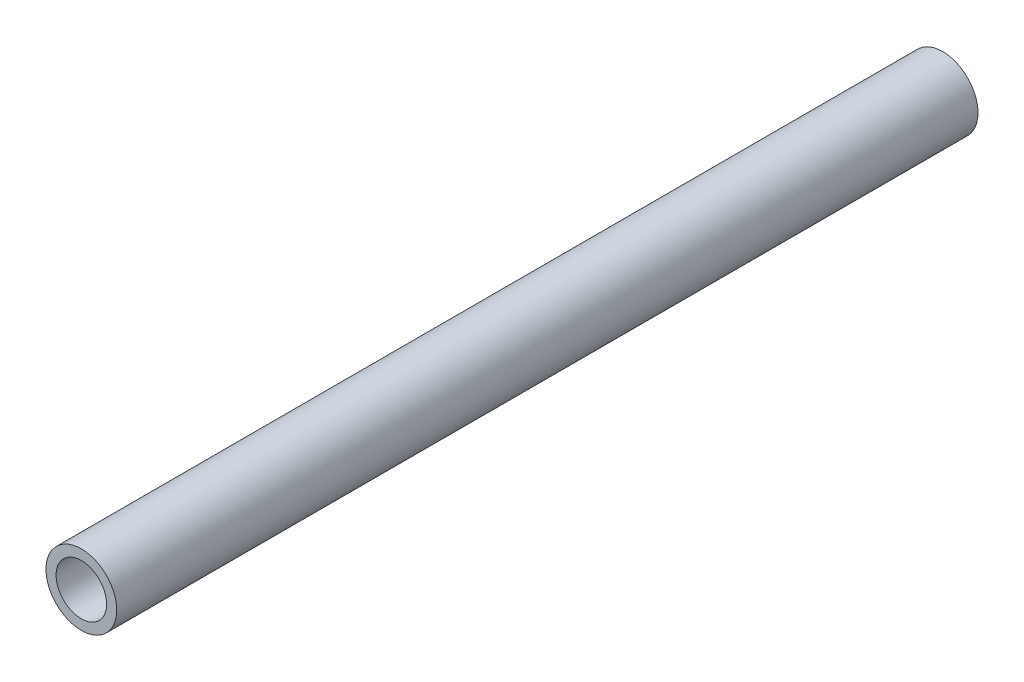
ISO-10303-21;
HEADER;
FILE_DESCRIPTION(('STEP AP214'),'2;1');
FILE_NAME('part.step','',(''),(''),'','','');
FILE_SCHEMA(('AUTOMOTIVE_DESIGN { 1 0 10303 214 1 1 1 1 }'));
ENDSEC;
DATA;
#1=APPLICATION_CONTEXT('core data for automotive mechanical design processes');
#2=APPLICATION_PROTOCOL_DEFINITION('international standard','automotive_design',2000,#1);
#3=PRODUCT_CONTEXT('',#1,'mechanical');
#4=PRODUCT('Part','Part','',(#3));
#5=PRODUCT_RELATED_PRODUCT_CATEGORY('part','',(#4));
#6=PRODUCT_DEFINITION_FORMATION('','',#4);
#7=PRODUCT_DEFINITION_CONTEXT('part definition',#1,'design');
#8=PRODUCT_DEFINITION('design','',#6,#7);
#9=PRODUCT_DEFINITION_SHAPE('','',#8);
#10=(LENGTH_UNIT() NAMED_UNIT(*) SI_UNIT(.MILLI.,.METRE.));
#11=(NAMED_UNIT(*) PLANE_ANGLE_UNIT() SI_UNIT($,.RADIAN.));
#12=(NAMED_UNIT(*) SI_UNIT($,.STERADIAN.) SOLID_ANGLE_UNIT());
#13=UNCERTAINTY_MEASURE_WITH_UNIT(LENGTH_MEASURE(1.E-05),#10,'distance_accuracy_value','');
#14=(GEOMETRIC_REPRESENTATION_CONTEXT(3) GLOBAL_UNCERTAINTY_ASSIGNED_CONTEXT((#13)) GLOBAL_UNIT_ASSIGNED_CONTEXT((#10,
#11,#12)) REPRESENTATION_CONTEXT('',''));
#15=CARTESIAN_POINT('',(0.,0.,0.));
#16=DIRECTION('',(0.,0.,1.));
#17=DIRECTION('',(1.,0.,0.));
#18=AXIS2_PLACEMENT_3D('',#15,#16,#17);
#19=CARTESIAN_POINT('',(0.,0.,-30.0521739130434));
#20=DIRECTION('',(0.,0.,-1.));
#21=DIRECTION('',(0.,1.,0.));
#22=AXIS2_PLACEMENT_3D('',#19,#20,#21);
#23=CYLINDRICAL_SURFACE('',#22,50.);
#24=CARTESIAN_POINT('',(0.,0.,0.));
#25=DIRECTION('',(0.,0.,-1.));
#26=DIRECTION('',(0.,1.,0.));
#27=AXIS2_PLACEMENT_3D('',#24,#25,#26);
#28=CIRCLE('',#27,50.);
#29=CARTESIAN_POINT('',(0.,50.,0.));
#30=VERTEX_POINT('',#29);
#31=EDGE_CURVE('E10',#30,#30,#28,.T.);
#32=ORIENTED_EDGE('',*,*,#31,.T.);
#33=EDGE_LOOP('',(#32));
#34=FACE_BOUND('',#33,.T.);
#35=CARTESIAN_POINT('',(0.,-2.01650560807022E-13,1705.));
#36=DIRECTION('',(0.,0.,-1.));
#37=DIRECTION('',(0.,1.,0.));
#38=AXIS2_PLACEMENT_3D('',#35,#36,#37);
#39=CIRCLE('',#38,50.0000000000001);
#40=CARTESIAN_POINT('',(0.,49.9999999999999,1705.));
#41=VERTEX_POINT('',#40);
#42=EDGE_CURVE('E50',#41,#41,#39,.T.);
#43=ORIENTED_EDGE('',*,*,#42,.F.);
#44=EDGE_LOOP('',(#43));
#45=FACE_BOUND('',#44,.T.);
#46=ADVANCED_FACE('F36',(#34,#45),#23,.F.);
#47=CARTESIAN_POINT('',(0.,50.,0.));
#48=DIRECTION('',(0.,0.,-1.));
#49=DIRECTION('',(0.,1.,0.));
#50=AXIS2_PLACEMENT_3D('',#47,#48,#49);
#51=PLANE('',#50);
#52=CARTESIAN_POINT('',(0.,0.,0.));
#53=DIRECTION('',(0.,0.,-1.));
#54=DIRECTION('',(0.,1.,0.));
#55=AXIS2_PLACEMENT_3D('',#52,#53,#54);
#56=CIRCLE('',#55,70.);
#57=CARTESIAN_POINT('',(0.,70.,0.));
#58=VERTEX_POINT('',#57);
#59=EDGE_CURVE('E42',#58,#58,#56,.T.);
#60=ORIENTED_EDGE('',*,*,#59,.T.);
#61=EDGE_LOOP('',(#60));
#62=FACE_BOUND('',#61,.T.);
#63=ORIENTED_EDGE('',*,*,#31,.F.);
#64=EDGE_LOOP('',(#63));
#65=FACE_BOUND('',#64,.T.);
#66=ADVANCED_FACE('F60',(#62,#65),#51,.T.);
#67=CARTESIAN_POINT('',(0.,0.,-30.0521739130434));
#68=DIRECTION('',(0.,0.,-1.));
#69=DIRECTION('',(0.,1.,0.));
#70=AXIS2_PLACEMENT_3D('',#67,#68,#69);
#71=CYLINDRICAL_SURFACE('',#70,70.);
#72=CARTESIAN_POINT('',(0.,-2.01650560807022E-13,1705.));
#73=DIRECTION('',(0.,0.,-1.));
#74=DIRECTION('',(0.,1.,0.));
#75=AXIS2_PLACEMENT_3D('',#72,#73,#74);
#76=CIRCLE('',#75,70.);
#77=CARTESIAN_POINT('',(0.,69.9999999999998,1705.));
#78=VERTEX_POINT('',#77);
#79=EDGE_CURVE('E46',#78,#78,#76,.T.);
#80=ORIENTED_EDGE('',*,*,#79,.T.);
#81=EDGE_LOOP('',(#80));
#82=FACE_BOUND('',#81,.T.);
#83=ORIENTED_EDGE('',*,*,#59,.F.);
#84=EDGE_LOOP('',(#83));
#85=FACE_BOUND('',#84,.T.);
#86=ADVANCED_FACE('F64',(#82,#85),#71,.T.);
#87=CARTESIAN_POINT('',(0.,69.9999999999998,1705.));
#88=DIRECTION('',(0.,0.,1.));
#89=DIRECTION('',(0.,-1.,0.));
#90=AXIS2_PLACEMENT_3D('',#87,#88,#89);
#91=PLANE('',#90);
#92=ORIENTED_EDGE('',*,*,#42,.T.);
#93=EDGE_LOOP('',(#92));
#94=FACE_BOUND('',#93,.T.);
#95=ORIENTED_EDGE('',*,*,#79,.F.);
#96=EDGE_LOOP('',(#95));
#97=FACE_BOUND('',#96,.T.);
#98=ADVANCED_FACE('F56',(#94,#97),#91,.T.);
#99=CLOSED_SHELL('',(#46,#66,#86,#98));
#100=MANIFOLD_SOLID_BREP('B2',#99);
#101=ADVANCED_BREP_SHAPE_REPRESENTATION('',(#18,#100),#14);
#102=SHAPE_DEFINITION_REPRESENTATION(#9,#101);
ENDSEC;
END-ISO-10303-21;
